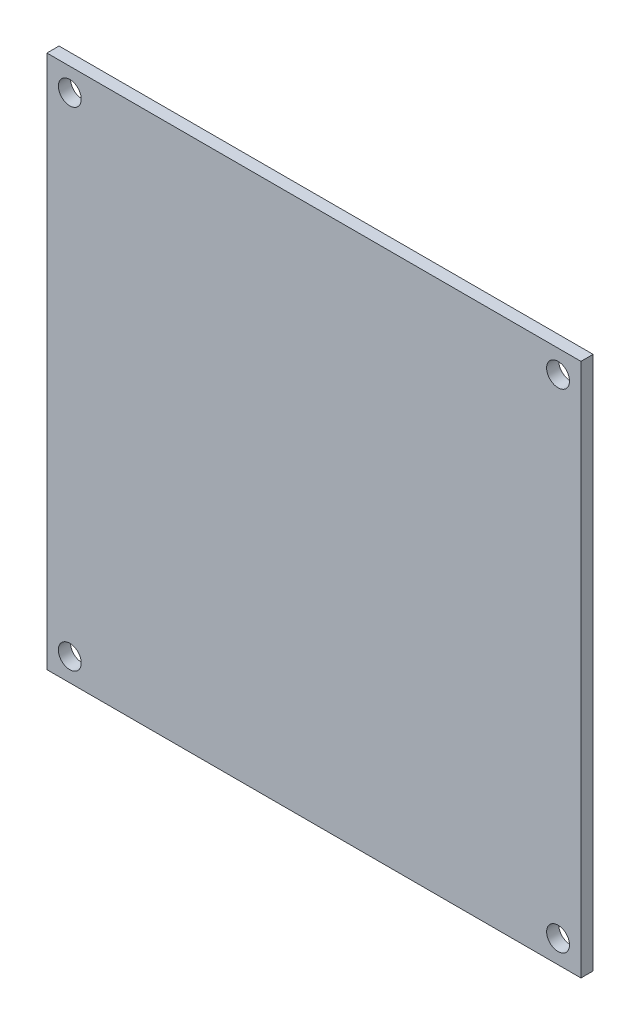
ISO-10303-21;
HEADER;
FILE_DESCRIPTION(('STEP AP214'),'2;1');
FILE_NAME('part.step','',(''),(''),'','','');
FILE_SCHEMA(('AUTOMOTIVE_DESIGN { 1 0 10303 214 1 1 1 1 }'));
ENDSEC;
DATA;
#1=APPLICATION_CONTEXT('core data for automotive mechanical design processes');
#2=APPLICATION_PROTOCOL_DEFINITION('international standard','automotive_design',2000,#1);
#3=PRODUCT_CONTEXT('',#1,'mechanical');
#4=PRODUCT('Part','Part','',(#3));
#5=PRODUCT_RELATED_PRODUCT_CATEGORY('part','',(#4));
#6=PRODUCT_DEFINITION_FORMATION('','',#4);
#7=PRODUCT_DEFINITION_CONTEXT('part definition',#1,'design');
#8=PRODUCT_DEFINITION('design','',#6,#7);
#9=PRODUCT_DEFINITION_SHAPE('','',#8);
#10=(LENGTH_UNIT() NAMED_UNIT(*) SI_UNIT(.MILLI.,.METRE.));
#11=(NAMED_UNIT(*) PLANE_ANGLE_UNIT() SI_UNIT($,.RADIAN.));
#12=(NAMED_UNIT(*) SI_UNIT($,.STERADIAN.) SOLID_ANGLE_UNIT());
#13=UNCERTAINTY_MEASURE_WITH_UNIT(LENGTH_MEASURE(1.E-05),#10,'distance_accuracy_value','');
#14=(GEOMETRIC_REPRESENTATION_CONTEXT(3) GLOBAL_UNCERTAINTY_ASSIGNED_CONTEXT((#13)) GLOBAL_UNIT_ASSIGNED_CONTEXT((#10,
#11,#12)) REPRESENTATION_CONTEXT('',''));
#15=CARTESIAN_POINT('',(0.,0.,0.));
#16=DIRECTION('',(0.,0.,1.));
#17=DIRECTION('',(1.,0.,0.));
#18=AXIS2_PLACEMENT_3D('',#15,#16,#17);
#19=CARTESIAN_POINT('',(0.,0.,-1.59143954));
#20=DIRECTION('',(0.,1.,0.));
#21=DIRECTION('',(1.,0.,0.));
#22=AXIS2_PLACEMENT_3D('',#19,#20,#21);
#23=PLANE('',#22);
#24=DIRECTION('',(1.,0.,0.));
#25=VECTOR('',#24,1.);
#26=CARTESIAN_POINT('',(0.,0.,0.));
#27=LINE('',#26,#25);
#28=CARTESIAN_POINT('',(0.,0.,0.));
#29=VERTEX_POINT('',#28);
#30=CARTESIAN_POINT('',(70.,0.,0.));
#31=VERTEX_POINT('',#30);
#32=EDGE_CURVE('E11',#29,#31,#27,.T.);
#33=ORIENTED_EDGE('',*,*,#32,.F.);
#34=DIRECTION('',(0.,0.,1.));
#35=VECTOR('',#34,1.);
#36=CARTESIAN_POINT('',(0.,0.,-1.59143954));
#37=LINE('',#36,#35);
#38=CARTESIAN_POINT('',(0.,0.,-1.59143954));
#39=VERTEX_POINT('',#38);
#40=EDGE_CURVE('E26',#39,#29,#37,.T.);
#41=ORIENTED_EDGE('',*,*,#40,.F.);
#42=DIRECTION('',(1.,0.,0.));
#43=VECTOR('',#42,1.);
#44=CARTESIAN_POINT('',(0.,0.,-1.59143954));
#45=LINE('',#44,#43);
#46=CARTESIAN_POINT('',(70.,0.,-1.59143954));
#47=VERTEX_POINT('',#46);
#48=EDGE_CURVE('E137',#39,#47,#45,.T.);
#49=ORIENTED_EDGE('',*,*,#48,.T.);
#50=DIRECTION('',(0.,0.,1.));
#51=VECTOR('',#50,1.);
#52=CARTESIAN_POINT('',(70.,0.,-1.59143954));
#53=LINE('',#52,#51);
#54=EDGE_CURVE('E39',#47,#31,#53,.T.);
#55=ORIENTED_EDGE('',*,*,#54,.T.);
#56=EDGE_LOOP('',(#33,#41,#49,#55));
#57=FACE_BOUND('',#56,.T.);
#58=ADVANCED_FACE('F19',(#57),#23,.F.);
#59=CARTESIAN_POINT('',(70.,0.,-1.59143954));
#60=DIRECTION('',(-1.,0.,0.));
#61=DIRECTION('',(0.,1.,0.));
#62=AXIS2_PLACEMENT_3D('',#59,#60,#61);
#63=PLANE('',#62);
#64=DIRECTION('',(0.,1.,0.));
#65=VECTOR('',#64,1.);
#66=CARTESIAN_POINT('',(70.,0.,0.));
#67=LINE('',#66,#65);
#68=CARTESIAN_POINT('',(70.,70.,0.));
#69=VERTEX_POINT('',#68);
#70=EDGE_CURVE('E133',#31,#69,#67,.T.);
#71=ORIENTED_EDGE('',*,*,#70,.F.);
#72=ORIENTED_EDGE('',*,*,#54,.F.);
#73=DIRECTION('',(0.,1.,0.));
#74=VECTOR('',#73,1.);
#75=CARTESIAN_POINT('',(70.,0.,-1.59143954));
#76=LINE('',#75,#74);
#77=CARTESIAN_POINT('',(70.,70.,-1.59143954));
#78=VERTEX_POINT('',#77);
#79=EDGE_CURVE('E130',#47,#78,#76,.T.);
#80=ORIENTED_EDGE('',*,*,#79,.T.);
#81=DIRECTION('',(0.,0.,1.));
#82=VECTOR('',#81,1.);
#83=CARTESIAN_POINT('',(70.,70.,-1.59143954));
#84=LINE('',#83,#82);
#85=EDGE_CURVE('E128',#78,#69,#84,.T.);
#86=ORIENTED_EDGE('',*,*,#85,.T.);
#87=EDGE_LOOP('',(#71,#72,#80,#86));
#88=FACE_BOUND('',#87,.T.);
#89=ADVANCED_FACE('F146',(#88),#63,.F.);
#90=CARTESIAN_POINT('',(70.,70.,-1.59143954));
#91=DIRECTION('',(0.,-1.,0.));
#92=DIRECTION('',(-1.,0.,0.));
#93=AXIS2_PLACEMENT_3D('',#90,#91,#92);
#94=PLANE('',#93);
#95=DIRECTION('',(-1.,0.,0.));
#96=VECTOR('',#95,1.);
#97=CARTESIAN_POINT('',(70.,70.,0.));
#98=LINE('',#97,#96);
#99=CARTESIAN_POINT('',(0.,70.,0.));
#100=VERTEX_POINT('',#99);
#101=EDGE_CURVE('E125',#69,#100,#98,.T.);
#102=ORIENTED_EDGE('',*,*,#101,.F.);
#103=ORIENTED_EDGE('',*,*,#85,.F.);
#104=DIRECTION('',(-1.,0.,0.));
#105=VECTOR('',#104,1.);
#106=CARTESIAN_POINT('',(70.,70.,-1.59143954));
#107=LINE('',#106,#105);
#108=CARTESIAN_POINT('',(0.,70.,-1.59143954));
#109=VERTEX_POINT('',#108);
#110=EDGE_CURVE('E122',#78,#109,#107,.T.);
#111=ORIENTED_EDGE('',*,*,#110,.T.);
#112=DIRECTION('',(0.,0.,1.));
#113=VECTOR('',#112,1.);
#114=CARTESIAN_POINT('',(0.,70.,-1.59143954));
#115=LINE('',#114,#113);
#116=EDGE_CURVE('E120',#109,#100,#115,.T.);
#117=ORIENTED_EDGE('',*,*,#116,.T.);
#118=EDGE_LOOP('',(#102,#103,#111,#117));
#119=FACE_BOUND('',#118,.T.);
#120=ADVANCED_FACE('F152',(#119),#94,.F.);
#121=CARTESIAN_POINT('',(0.,70.,-1.59143954));
#122=DIRECTION('',(1.,0.,0.));
#123=DIRECTION('',(0.,-1.,0.));
#124=AXIS2_PLACEMENT_3D('',#121,#122,#123);
#125=PLANE('',#124);
#126=DIRECTION('',(0.,-1.,0.));
#127=VECTOR('',#126,1.);
#128=CARTESIAN_POINT('',(0.,70.,0.));
#129=LINE('',#128,#127);
#130=EDGE_CURVE('E117',#100,#29,#129,.T.);
#131=ORIENTED_EDGE('',*,*,#130,.F.);
#132=ORIENTED_EDGE('',*,*,#116,.F.);
#133=DIRECTION('',(0.,-1.,0.));
#134=VECTOR('',#133,1.);
#135=CARTESIAN_POINT('',(0.,70.,-1.59143954));
#136=LINE('',#135,#134);
#137=EDGE_CURVE('E115',#109,#39,#136,.T.);
#138=ORIENTED_EDGE('',*,*,#137,.T.);
#139=ORIENTED_EDGE('',*,*,#40,.T.);
#140=EDGE_LOOP('',(#131,#132,#138,#139));
#141=FACE_BOUND('',#140,.T.);
#142=ADVANCED_FACE('F153',(#141),#125,.F.);
#143=CARTESIAN_POINT('',(2.99999908,2.99999908,-1.59143954));
#144=DIRECTION('',(0.,0.,-1.));
#145=DIRECTION('',(1.,0.,0.));
#146=AXIS2_PLACEMENT_3D('',#143,#144,#145);
#147=CYLINDRICAL_SURFACE('',#146,1.49999954);
#148=DIRECTION('',(0.,0.,1.));
#149=VECTOR('',#148,1.);
#150=CARTESIAN_POINT('',(4.49999862,2.99999908,-1.59143954));
#151=LINE('',#150,#149);
#152=CARTESIAN_POINT('',(4.49999862,2.99999908,-1.59143954));
#153=VERTEX_POINT('',#152);
#154=CARTESIAN_POINT('',(4.49999862,2.99999908,0.));
#155=VERTEX_POINT('',#154);
#156=EDGE_CURVE('E113',#153,#155,#151,.T.);
#157=ORIENTED_EDGE('',*,*,#156,.T.);
#158=CARTESIAN_POINT('',(2.99999908,2.99999908,0.));
#159=DIRECTION('',(0.,0.,1.));
#160=DIRECTION('',(1.,0.,0.));
#161=AXIS2_PLACEMENT_3D('',#158,#159,#160);
#162=CIRCLE('',#161,1.49999954);
#163=EDGE_CURVE('E108',#155,#155,#162,.T.);
#164=ORIENTED_EDGE('',*,*,#163,.T.);
#165=ORIENTED_EDGE('',*,*,#156,.F.);
#166=CARTESIAN_POINT('',(2.99999908,2.99999908,-1.59143954));
#167=DIRECTION('',(0.,0.,1.));
#168=DIRECTION('',(1.,0.,0.));
#169=AXIS2_PLACEMENT_3D('',#166,#167,#168);
#170=CIRCLE('',#169,1.49999954);
#171=EDGE_CURVE('E103',#153,#153,#170,.T.);
#172=ORIENTED_EDGE('',*,*,#171,.F.);
#173=EDGE_LOOP('',(#157,#164,#165,#172));
#174=FACE_BOUND('',#173,.T.);
#175=ADVANCED_FACE('F155',(#174),#147,.F.);
#176=CARTESIAN_POINT('',(2.99999908,67.00000062,-1.59143954));
#177=DIRECTION('',(0.,0.,-1.));
#178=DIRECTION('',(1.,0.,0.));
#179=AXIS2_PLACEMENT_3D('',#176,#177,#178);
#180=CYLINDRICAL_SURFACE('',#179,1.49999954);
#181=DIRECTION('',(0.,0.,1.));
#182=VECTOR('',#181,1.);
#183=CARTESIAN_POINT('',(4.49999862,67.00000062,-1.59143954));
#184=LINE('',#183,#182);
#185=CARTESIAN_POINT('',(4.49999862,67.00000062,-1.59143954));
#186=VERTEX_POINT('',#185);
#187=CARTESIAN_POINT('',(4.49999862,67.00000062,0.));
#188=VERTEX_POINT('',#187);
#189=EDGE_CURVE('E109',#186,#188,#184,.T.);
#190=ORIENTED_EDGE('',*,*,#189,.T.);
#191=CARTESIAN_POINT('',(2.99999908,67.00000062,0.));
#192=DIRECTION('',(0.,0.,1.));
#193=DIRECTION('',(1.,0.,0.));
#194=AXIS2_PLACEMENT_3D('',#191,#192,#193);
#195=CIRCLE('',#194,1.49999954);
#196=EDGE_CURVE('E250',#188,#188,#195,.T.);
#197=ORIENTED_EDGE('',*,*,#196,.T.);
#198=ORIENTED_EDGE('',*,*,#189,.F.);
#199=CARTESIAN_POINT('',(2.99999908,67.00000062,-1.59143954));
#200=DIRECTION('',(0.,0.,1.));
#201=DIRECTION('',(1.,0.,0.));
#202=AXIS2_PLACEMENT_3D('',#199,#200,#201);
#203=CIRCLE('',#202,1.49999954);
#204=EDGE_CURVE('E247',#186,#186,#203,.T.);
#205=ORIENTED_EDGE('',*,*,#204,.F.);
#206=EDGE_LOOP('',(#190,#197,#198,#205));
#207=FACE_BOUND('',#206,.T.);
#208=ADVANCED_FACE('F162',(#207),#180,.F.);
#209=CARTESIAN_POINT('',(67.00000062,2.99999908,-1.59143954));
#210=DIRECTION('',(0.,0.,-1.));
#211=DIRECTION('',(1.,0.,0.));
#212=AXIS2_PLACEMENT_3D('',#209,#210,#211);
#213=CYLINDRICAL_SURFACE('',#212,1.49999954);
#214=DIRECTION('',(0.,0.,1.));
#215=VECTOR('',#214,1.);
#216=CARTESIAN_POINT('',(68.50000016,2.99999908,-1.59143954));
#217=LINE('',#216,#215);
#218=CARTESIAN_POINT('',(68.50000016,2.99999908,-1.59143954));
#219=VERTEX_POINT('',#218);
#220=CARTESIAN_POINT('',(68.50000016,2.99999908,0.));
#221=VERTEX_POINT('',#220);
#222=EDGE_CURVE('E243',#219,#221,#217,.T.);
#223=ORIENTED_EDGE('',*,*,#222,.T.);
#224=CARTESIAN_POINT('',(67.00000062,2.99999908,0.));
#225=DIRECTION('',(0.,0.,1.));
#226=DIRECTION('',(1.,0.,0.));
#227=AXIS2_PLACEMENT_3D('',#224,#225,#226);
#228=CIRCLE('',#227,1.49999954);
#229=EDGE_CURVE('E245',#221,#221,#228,.T.);
#230=ORIENTED_EDGE('',*,*,#229,.T.);
#231=ORIENTED_EDGE('',*,*,#222,.F.);
#232=CARTESIAN_POINT('',(67.00000062,2.99999908,-1.59143954));
#233=DIRECTION('',(0.,0.,1.));
#234=DIRECTION('',(1.,0.,0.));
#235=AXIS2_PLACEMENT_3D('',#232,#233,#234);
#236=CIRCLE('',#235,1.49999954);
#237=EDGE_CURVE('E88',#219,#219,#236,.T.);
#238=ORIENTED_EDGE('',*,*,#237,.F.);
#239=EDGE_LOOP('',(#223,#230,#231,#238));
#240=FACE_BOUND('',#239,.T.);
#241=ADVANCED_FACE('F203',(#240),#213,.F.);
#242=CARTESIAN_POINT('',(67.00000062,67.00000062,-1.59143954));
#243=DIRECTION('',(0.,0.,-1.));
#244=DIRECTION('',(1.,0.,0.));
#245=AXIS2_PLACEMENT_3D('',#242,#243,#244);
#246=CYLINDRICAL_SURFACE('',#245,1.49999954);
#247=DIRECTION('',(0.,0.,1.));
#248=VECTOR('',#247,1.);
#249=CARTESIAN_POINT('',(68.50000016,67.00000062,-1.59143954));
#250=LINE('',#249,#248);
#251=CARTESIAN_POINT('',(68.50000016,67.00000062,-1.59143954));
#252=VERTEX_POINT('',#251);
#253=CARTESIAN_POINT('',(68.50000016,67.00000062,0.));
#254=VERTEX_POINT('',#253);
#255=EDGE_CURVE('E82',#252,#254,#250,.T.);
#256=ORIENTED_EDGE('',*,*,#255,.T.);
#257=CARTESIAN_POINT('',(67.00000062,67.00000062,0.));
#258=DIRECTION('',(0.,0.,1.));
#259=DIRECTION('',(1.,0.,0.));
#260=AXIS2_PLACEMENT_3D('',#257,#258,#259);
#261=CIRCLE('',#260,1.49999954);
#262=EDGE_CURVE('E87',#254,#254,#261,.T.);
#263=ORIENTED_EDGE('',*,*,#262,.T.);
#264=ORIENTED_EDGE('',*,*,#255,.F.);
#265=CARTESIAN_POINT('',(67.00000062,67.00000062,-1.59143954));
#266=DIRECTION('',(0.,0.,1.));
#267=DIRECTION('',(1.,0.,0.));
#268=AXIS2_PLACEMENT_3D('',#265,#266,#267);
#269=CIRCLE('',#268,1.49999954);
#270=EDGE_CURVE('E85',#252,#252,#269,.T.);
#271=ORIENTED_EDGE('',*,*,#270,.F.);
#272=EDGE_LOOP('',(#256,#263,#264,#271));
#273=FACE_BOUND('',#272,.T.);
#274=ADVANCED_FACE('F84',(#273),#246,.F.);
#275=CARTESIAN_POINT('',(0.,0.,-1.59143954));
#276=DIRECTION('',(0.,0.,-1.));
#277=DIRECTION('',(-1.,0.,0.));
#278=AXIS2_PLACEMENT_3D('',#275,#276,#277);
#279=PLANE('',#278);
#280=ORIENTED_EDGE('',*,*,#137,.F.);
#281=ORIENTED_EDGE('',*,*,#110,.F.);
#282=ORIENTED_EDGE('',*,*,#79,.F.);
#283=ORIENTED_EDGE('',*,*,#48,.F.);
#284=EDGE_LOOP('',(#280,#281,#282,#283));
#285=FACE_BOUND('',#284,.T.);
#286=ORIENTED_EDGE('',*,*,#171,.T.);
#287=EDGE_LOOP('',(#286));
#288=FACE_BOUND('',#287,.T.);
#289=ORIENTED_EDGE('',*,*,#204,.T.);
#290=EDGE_LOOP('',(#289));
#291=FACE_BOUND('',#290,.T.);
#292=ORIENTED_EDGE('',*,*,#237,.T.);
#293=EDGE_LOOP('',(#292));
#294=FACE_BOUND('',#293,.T.);
#295=ORIENTED_EDGE('',*,*,#270,.T.);
#296=EDGE_LOOP('',(#295));
#297=FACE_BOUND('',#296,.T.);
#298=ADVANCED_FACE('F91',(#285,#288,#291,#294,#297),#279,.T.);
#299=CARTESIAN_POINT('',(0.,0.,0.));
#300=DIRECTION('',(0.,0.,-1.));
#301=DIRECTION('',(-1.,0.,0.));
#302=AXIS2_PLACEMENT_3D('',#299,#300,#301);
#303=PLANE('',#302);
#304=ORIENTED_EDGE('',*,*,#32,.T.);
#305=ORIENTED_EDGE('',*,*,#70,.T.);
#306=ORIENTED_EDGE('',*,*,#101,.T.);
#307=ORIENTED_EDGE('',*,*,#130,.T.);
#308=EDGE_LOOP('',(#304,#305,#306,#307));
#309=FACE_BOUND('',#308,.T.);
#310=ORIENTED_EDGE('',*,*,#163,.F.);
#311=EDGE_LOOP('',(#310));
#312=FACE_BOUND('',#311,.T.);
#313=ORIENTED_EDGE('',*,*,#196,.F.);
#314=EDGE_LOOP('',(#313));
#315=FACE_BOUND('',#314,.T.);
#316=ORIENTED_EDGE('',*,*,#229,.F.);
#317=EDGE_LOOP('',(#316));
#318=FACE_BOUND('',#317,.T.);
#319=ORIENTED_EDGE('',*,*,#262,.F.);
#320=EDGE_LOOP('',(#319));
#321=FACE_BOUND('',#320,.T.);
#322=ADVANCED_FACE('F149',(#309,#312,#315,#318,#321),#303,.F.);
#323=CLOSED_SHELL('',(#58,#89,#120,#142,#175,#208,#241,#274,#298,#322));
#324=MANIFOLD_SOLID_BREP('B1',#323);
#325=ADVANCED_BREP_SHAPE_REPRESENTATION('',(#18,#324),#14);
#326=SHAPE_DEFINITION_REPRESENTATION(#9,#325);
ENDSEC;
END-ISO-10303-21;
